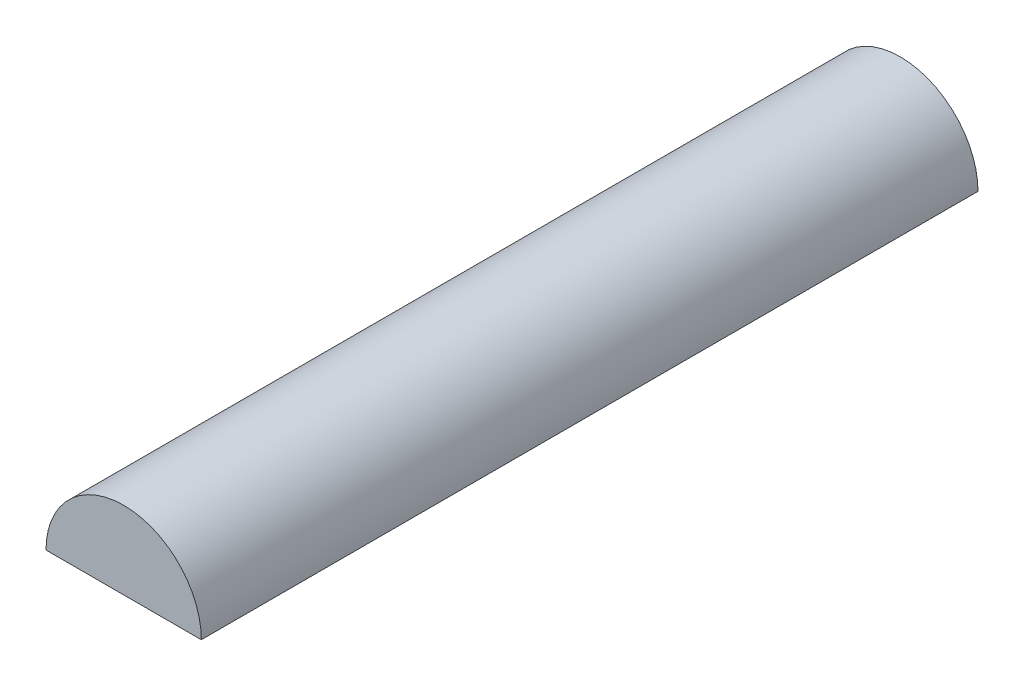
ISO-10303-21;
HEADER;
FILE_DESCRIPTION(('STEP AP214'),'2;1');
FILE_NAME('part.step','',(''),(''),'','','');
FILE_SCHEMA(('AUTOMOTIVE_DESIGN { 1 0 10303 214 1 1 1 1 }'));
ENDSEC;
DATA;
#1=APPLICATION_CONTEXT('core data for automotive mechanical design processes');
#2=APPLICATION_PROTOCOL_DEFINITION('international standard','automotive_design',2000,#1);
#3=PRODUCT_CONTEXT('',#1,'mechanical');
#4=PRODUCT('Part','Part','',(#3));
#5=PRODUCT_RELATED_PRODUCT_CATEGORY('part','',(#4));
#6=PRODUCT_DEFINITION_FORMATION('','',#4);
#7=PRODUCT_DEFINITION_CONTEXT('part definition',#1,'design');
#8=PRODUCT_DEFINITION('design','',#6,#7);
#9=PRODUCT_DEFINITION_SHAPE('','',#8);
#10=(LENGTH_UNIT() NAMED_UNIT(*) SI_UNIT(.MILLI.,.METRE.));
#11=(NAMED_UNIT(*) PLANE_ANGLE_UNIT() SI_UNIT($,.RADIAN.));
#12=(NAMED_UNIT(*) SI_UNIT($,.STERADIAN.) SOLID_ANGLE_UNIT());
#13=UNCERTAINTY_MEASURE_WITH_UNIT(LENGTH_MEASURE(1.E-05),#10,'distance_accuracy_value','');
#14=(GEOMETRIC_REPRESENTATION_CONTEXT(3) GLOBAL_UNCERTAINTY_ASSIGNED_CONTEXT((#13)) GLOBAL_UNIT_ASSIGNED_CONTEXT((#10,
#11,#12)) REPRESENTATION_CONTEXT('',''));
#15=CARTESIAN_POINT('',(0.,0.,0.));
#16=DIRECTION('',(0.,0.,1.));
#17=DIRECTION('',(1.,0.,0.));
#18=AXIS2_PLACEMENT_3D('',#15,#16,#17);
#19=CARTESIAN_POINT('',(-10.01,-0.01,50.));
#20=DIRECTION('',(0.,0.,1.));
#21=DIRECTION('',(1.,0.,0.));
#22=AXIS2_PLACEMENT_3D('',#19,#20,#21);
#23=PLANE('',#22);
#24=DIRECTION('',(-1.,0.,0.));
#25=VECTOR('',#24,1.);
#26=CARTESIAN_POINT('',(0.,0.,50.));
#27=LINE('',#26,#25);
#28=CARTESIAN_POINT('',(10.,0.,50.));
#29=VERTEX_POINT('',#28);
#30=CARTESIAN_POINT('',(-10.,0.,50.));
#31=VERTEX_POINT('',#30);
#32=EDGE_CURVE('E40',#29,#31,#27,.T.);
#33=ORIENTED_EDGE('',*,*,#32,.F.);
#34=CARTESIAN_POINT('',(0.,0.,50.));
#35=DIRECTION('',(0.,0.,-1.));
#36=DIRECTION('',(-1.,0.,0.));
#37=AXIS2_PLACEMENT_3D('',#34,#35,#36);
#38=CIRCLE('',#37,10.);
#39=EDGE_CURVE('E20',#31,#29,#38,.T.);
#40=ORIENTED_EDGE('',*,*,#39,.F.);
#41=EDGE_LOOP('',(#33,#40));
#42=FACE_BOUND('',#41,.T.);
#43=ADVANCED_FACE('F16',(#42),#23,.T.);
#44=CARTESIAN_POINT('',(-10.01,0.,-50.01));
#45=DIRECTION('',(0.,-1.,0.));
#46=DIRECTION('',(1.,0.,0.));
#47=AXIS2_PLACEMENT_3D('',#44,#45,#46);
#48=PLANE('',#47);
#49=DIRECTION('',(0.,0.,1.));
#50=VECTOR('',#49,1.);
#51=CARTESIAN_POINT('',(-10.,0.,0.));
#52=LINE('',#51,#50);
#53=CARTESIAN_POINT('',(-10.,0.,-50.));
#54=VERTEX_POINT('',#53);
#55=EDGE_CURVE('E34',#54,#31,#52,.T.);
#56=ORIENTED_EDGE('',*,*,#55,.F.);
#57=DIRECTION('',(-1.,0.,0.));
#58=VECTOR('',#57,1.);
#59=CARTESIAN_POINT('',(0.,0.,-50.));
#60=LINE('',#59,#58);
#61=CARTESIAN_POINT('',(10.,0.,-50.));
#62=VERTEX_POINT('',#61);
#63=EDGE_CURVE('E26',#62,#54,#60,.T.);
#64=ORIENTED_EDGE('',*,*,#63,.F.);
#65=DIRECTION('',(0.,0.,-1.));
#66=VECTOR('',#65,1.);
#67=CARTESIAN_POINT('',(10.,0.,0.));
#68=LINE('',#67,#66);
#69=EDGE_CURVE('E46',#29,#62,#68,.T.);
#70=ORIENTED_EDGE('',*,*,#69,.F.);
#71=ORIENTED_EDGE('',*,*,#32,.T.);
#72=EDGE_LOOP('',(#56,#64,#70,#71));
#73=FACE_BOUND('',#72,.T.);
#74=ADVANCED_FACE('F47',(#73),#48,.T.);
#75=CARTESIAN_POINT('',(0.,0.,50.));
#76=DIRECTION('',(0.,0.,-1.));
#77=DIRECTION('',(-1.,0.,0.));
#78=AXIS2_PLACEMENT_3D('',#75,#76,#77);
#79=CYLINDRICAL_SURFACE('',#78,10.);
#80=ORIENTED_EDGE('',*,*,#69,.T.);
#81=CARTESIAN_POINT('',(0.,0.,-50.));
#82=DIRECTION('',(0.,0.,-1.));
#83=DIRECTION('',(-1.,0.,0.));
#84=AXIS2_PLACEMENT_3D('',#81,#82,#83);
#85=CIRCLE('',#84,10.);
#86=EDGE_CURVE('E11',#54,#62,#85,.T.);
#87=ORIENTED_EDGE('',*,*,#86,.F.);
#88=ORIENTED_EDGE('',*,*,#55,.T.);
#89=ORIENTED_EDGE('',*,*,#39,.T.);
#90=EDGE_LOOP('',(#80,#87,#88,#89));
#91=FACE_BOUND('',#90,.T.);
#92=ADVANCED_FACE('F51',(#91),#79,.T.);
#93=CARTESIAN_POINT('',(10.01,-0.01,-50.));
#94=DIRECTION('',(0.,0.,-1.));
#95=DIRECTION('',(-1.,0.,0.));
#96=AXIS2_PLACEMENT_3D('',#93,#94,#95);
#97=PLANE('',#96);
#98=ORIENTED_EDGE('',*,*,#63,.T.);
#99=ORIENTED_EDGE('',*,*,#86,.T.);
#100=EDGE_LOOP('',(#98,#99));
#101=FACE_BOUND('',#100,.T.);
#102=ADVANCED_FACE('F18',(#101),#97,.T.);
#103=CLOSED_SHELL('',(#43,#74,#92,#102));
#104=MANIFOLD_SOLID_BREP('B1',#103);
#105=ADVANCED_BREP_SHAPE_REPRESENTATION('',(#18,#104),#14);
#106=SHAPE_DEFINITION_REPRESENTATION(#9,#105);
ENDSEC;
END-ISO-10303-21;
